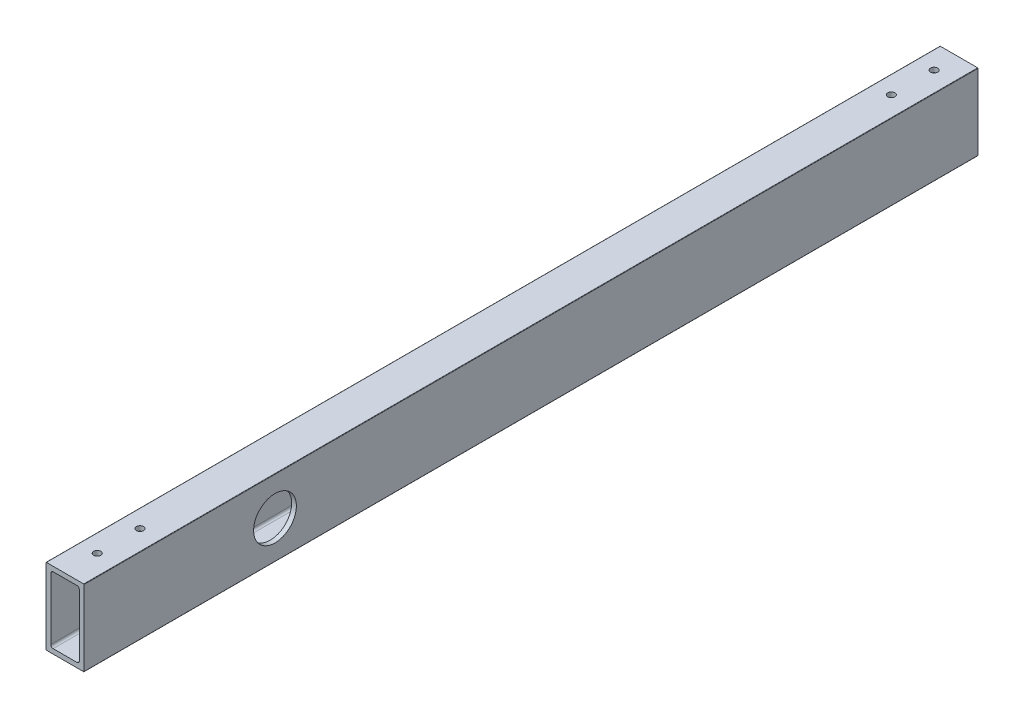
ISO-10303-21;
HEADER;
FILE_DESCRIPTION(('STEP AP214'),'2;1');
FILE_NAME('part.step','',(''),(''),'','','');
FILE_SCHEMA(('AUTOMOTIVE_DESIGN { 1 0 10303 214 1 1 1 1 }'));
ENDSEC;
DATA;
#1=APPLICATION_CONTEXT('core data for automotive mechanical design processes');
#2=APPLICATION_PROTOCOL_DEFINITION('international standard','automotive_design',2000,#1);
#3=PRODUCT_CONTEXT('',#1,'mechanical');
#4=PRODUCT('Part','Part','',(#3));
#5=PRODUCT_RELATED_PRODUCT_CATEGORY('part','',(#4));
#6=PRODUCT_DEFINITION_FORMATION('','',#4);
#7=PRODUCT_DEFINITION_CONTEXT('part definition',#1,'design');
#8=PRODUCT_DEFINITION('design','',#6,#7);
#9=PRODUCT_DEFINITION_SHAPE('','',#8);
#10=(LENGTH_UNIT() NAMED_UNIT(*) SI_UNIT(.MILLI.,.METRE.));
#11=(NAMED_UNIT(*) PLANE_ANGLE_UNIT() SI_UNIT($,.RADIAN.));
#12=(NAMED_UNIT(*) SI_UNIT($,.STERADIAN.) SOLID_ANGLE_UNIT());
#13=UNCERTAINTY_MEASURE_WITH_UNIT(LENGTH_MEASURE(1.E-05),#10,'distance_accuracy_value','');
#14=(GEOMETRIC_REPRESENTATION_CONTEXT(3) GLOBAL_UNCERTAINTY_ASSIGNED_CONTEXT((#13)) GLOBAL_UNIT_ASSIGNED_CONTEXT((#10,
#11,#12)) REPRESENTATION_CONTEXT('',''));
#15=CARTESIAN_POINT('',(0.,0.,0.));
#16=DIRECTION('',(0.,0.,1.));
#17=DIRECTION('',(1.,0.,0.));
#18=AXIS2_PLACEMENT_3D('',#15,#16,#17);
#19=CARTESIAN_POINT('',(3.175,4.7625,1828.8));
#20=DIRECTION('',(1.,0.,0.));
#21=DIRECTION('',(0.,1.,0.));
#22=AXIS2_PLACEMENT_3D('',#19,#20,#21);
#23=PLANE('',#22);
#24=CARTESIAN_POINT('',(3.175,25.146,475.742));
#25=DIRECTION('',(1.,0.,0.));
#26=DIRECTION('',(0.,0.,-1.));
#27=AXIS2_PLACEMENT_3D('',#24,#25,#26);
#28=CIRCLE('',#27,14.2875);
#29=CARTESIAN_POINT('',(3.175,25.146,490.0295));
#30=VERTEX_POINT('',#29);
#31=EDGE_CURVE('E497',#30,#30,#28,.T.);
#32=ORIENTED_EDGE('',*,*,#31,.F.);
#33=EDGE_LOOP('',(#32));
#34=FACE_BOUND('',#33,.T.);
#35=DIRECTION('',(0.,0.,-1.));
#36=VECTOR('',#35,1.);
#37=CARTESIAN_POINT('',(3.175,4.7625,1828.8));
#38=LINE('',#37,#36);
#39=CARTESIAN_POINT('',(3.175,4.7625,603.25));
#40=VERTEX_POINT('',#39);
#41=CARTESIAN_POINT('',(3.175,4.7625,6.35000000000008));
#42=VERTEX_POINT('',#41);
#43=EDGE_CURVE('E223',#40,#42,#38,.T.);
#44=ORIENTED_EDGE('',*,*,#43,.T.);
#45=DIRECTION('',(0.,1.,0.));
#46=VECTOR('',#45,1.);
#47=CARTESIAN_POINT('',(3.175,4.7625,6.35000000000008));
#48=LINE('',#47,#46);
#49=CARTESIAN_POINT('',(3.175,46.0375,6.35000000000008));
#50=VERTEX_POINT('',#49);
#51=EDGE_CURVE('E58',#42,#50,#48,.T.);
#52=ORIENTED_EDGE('',*,*,#51,.T.);
#53=DIRECTION('',(0.,0.,-1.));
#54=VECTOR('',#53,1.);
#55=CARTESIAN_POINT('',(3.175,46.0375,1828.8));
#56=LINE('',#55,#54);
#57=CARTESIAN_POINT('',(3.175,46.0375,603.25));
#58=VERTEX_POINT('',#57);
#59=EDGE_CURVE('E198',#58,#50,#56,.T.);
#60=ORIENTED_EDGE('',*,*,#59,.F.);
#61=DIRECTION('',(0.,-1.,0.));
#62=VECTOR('',#61,1.);
#63=CARTESIAN_POINT('',(3.175,4.7625,603.25));
#64=LINE('',#63,#62);
#65=EDGE_CURVE('E184',#58,#40,#64,.T.);
#66=ORIENTED_EDGE('',*,*,#65,.T.);
#67=EDGE_LOOP('',(#44,#52,#60,#66));
#68=FACE_BOUND('',#67,.T.);
#69=ADVANCED_FACE('F43',(#34,#68),#23,.T.);
#70=CARTESIAN_POINT('',(4.7625,46.0375,1828.8));
#71=DIRECTION('',(0.,0.,-1.));
#72=DIRECTION('',(-1.,0.,0.));
#73=AXIS2_PLACEMENT_3D('',#70,#71,#72);
#74=CYLINDRICAL_SURFACE('',#73,1.5875);
#75=CARTESIAN_POINT('',(4.7625,46.0375,6.35000000000008));
#76=DIRECTION('',(0.,0.,-1.));
#77=DIRECTION('',(-1.,0.,0.));
#78=AXIS2_PLACEMENT_3D('',#75,#76,#77);
#79=CIRCLE('',#78,1.5875);
#80=CARTESIAN_POINT('',(4.7625,47.625,6.35000000000008));
#81=VERTEX_POINT('',#80);
#82=EDGE_CURVE('E254',#81,#50,#79,.F.);
#83=ORIENTED_EDGE('',*,*,#82,.F.);
#84=DIRECTION('',(0.,0.,-1.));
#85=VECTOR('',#84,1.);
#86=CARTESIAN_POINT('',(4.7625,47.625,1828.8));
#87=LINE('',#86,#85);
#88=CARTESIAN_POINT('',(4.7625,47.625,603.25));
#89=VERTEX_POINT('',#88);
#90=EDGE_CURVE('E201',#89,#81,#87,.T.);
#91=ORIENTED_EDGE('',*,*,#90,.F.);
#92=CARTESIAN_POINT('',(4.7625,46.0375,603.25));
#93=DIRECTION('',(0.,0.,1.));
#94=DIRECTION('',(1.,0.,0.));
#95=AXIS2_PLACEMENT_3D('',#92,#93,#94);
#96=CIRCLE('',#95,1.5875);
#97=EDGE_CURVE('E314',#58,#89,#96,.F.);
#98=ORIENTED_EDGE('',*,*,#97,.F.);
#99=ORIENTED_EDGE('',*,*,#59,.T.);
#100=EDGE_LOOP('',(#83,#91,#98,#99));
#101=FACE_BOUND('',#100,.T.);
#102=ADVANCED_FACE('F367',(#101),#74,.F.);
#103=CARTESIAN_POINT('',(4.7625,47.625,1828.8));
#104=DIRECTION('',(0.,-1.,0.));
#105=DIRECTION('',(0.,0.,-1.));
#106=AXIS2_PLACEMENT_3D('',#103,#104,#105);
#107=PLANE('',#106);
#108=CARTESIAN_POINT('',(11.9757060888018,47.625,581.025));
#109=DIRECTION('',(0.,-1.,0.));
#110=DIRECTION('',(0.,0.,-1.));
#111=AXIS2_PLACEMENT_3D('',#108,#109,#110);
#112=CIRCLE('',#111,2.38125000000002);
#113=CARTESIAN_POINT('',(11.9757060888018,47.625,578.64375));
#114=VERTEX_POINT('',#113);
#115=EDGE_CURVE('E283',#114,#114,#112,.T.);
#116=ORIENTED_EDGE('',*,*,#115,.F.);
#117=EDGE_LOOP('',(#116));
#118=FACE_BOUND('',#117,.T.);
#119=CARTESIAN_POINT('',(11.9757060888017,47.625,50.8));
#120=DIRECTION('',(0.,-1.,0.));
#121=DIRECTION('',(0.,0.,-1.));
#122=AXIS2_PLACEMENT_3D('',#119,#120,#121);
#123=CIRCLE('',#122,2.38125);
#124=CARTESIAN_POINT('',(11.9757060888017,47.625,48.41875));
#125=VERTEX_POINT('',#124);
#126=EDGE_CURVE('E280',#125,#125,#123,.T.);
#127=ORIENTED_EDGE('',*,*,#126,.F.);
#128=EDGE_LOOP('',(#127));
#129=FACE_BOUND('',#128,.T.);
#130=CARTESIAN_POINT('',(11.9757060888017,47.625,22.2249999999999));
#131=DIRECTION('',(0.,-1.,0.));
#132=DIRECTION('',(0.,0.,-1.));
#133=AXIS2_PLACEMENT_3D('',#130,#131,#132);
#134=CIRCLE('',#133,2.38125);
#135=CARTESIAN_POINT('',(11.9757060888017,47.625,19.8437499999999));
#136=VERTEX_POINT('',#135);
#137=EDGE_CURVE('E277',#136,#136,#134,.T.);
#138=ORIENTED_EDGE('',*,*,#137,.F.);
#139=EDGE_LOOP('',(#138));
#140=FACE_BOUND('',#139,.T.);
#141=CARTESIAN_POINT('',(11.9757060888018,47.625,552.45));
#142=DIRECTION('',(0.,-1.,0.));
#143=DIRECTION('',(0.,0.,-1.));
#144=AXIS2_PLACEMENT_3D('',#141,#142,#143);
#145=CIRCLE('',#144,2.38125000000002);
#146=CARTESIAN_POINT('',(11.9757060888018,47.625,550.06875));
#147=VERTEX_POINT('',#146);
#148=EDGE_CURVE('E266',#147,#147,#145,.T.);
#149=ORIENTED_EDGE('',*,*,#148,.F.);
#150=EDGE_LOOP('',(#149));
#151=FACE_BOUND('',#150,.T.);
#152=ORIENTED_EDGE('',*,*,#90,.T.);
#153=DIRECTION('',(1.,0.,0.));
#154=VECTOR('',#153,1.);
#155=CARTESIAN_POINT('',(4.7625,47.625,6.35000000000008));
#156=LINE('',#155,#154);
#157=CARTESIAN_POINT('',(20.6375,47.625,6.35000000000008));
#158=VERTEX_POINT('',#157);
#159=EDGE_CURVE('E253',#81,#158,#156,.T.);
#160=ORIENTED_EDGE('',*,*,#159,.T.);
#161=DIRECTION('',(0.,0.,-1.));
#162=VECTOR('',#161,1.);
#163=CARTESIAN_POINT('',(20.6375,47.625,1828.8));
#164=LINE('',#163,#162);
#165=CARTESIAN_POINT('',(20.6375,47.625,603.25));
#166=VERTEX_POINT('',#165);
#167=EDGE_CURVE('E212',#166,#158,#164,.T.);
#168=ORIENTED_EDGE('',*,*,#167,.F.);
#169=DIRECTION('',(-1.,0.,0.));
#170=VECTOR('',#169,1.);
#171=CARTESIAN_POINT('',(4.7625,47.625,603.25));
#172=LINE('',#171,#170);
#173=EDGE_CURVE('E251',#166,#89,#172,.T.);
#174=ORIENTED_EDGE('',*,*,#173,.T.);
#175=EDGE_LOOP('',(#152,#160,#168,#174));
#176=FACE_BOUND('',#175,.T.);
#177=ADVANCED_FACE('F250',(#118,#129,#140,#151,#176),#107,.T.);
#178=CARTESIAN_POINT('',(20.6375,46.0375,1828.8));
#179=DIRECTION('',(0.,0.,-1.));
#180=DIRECTION('',(-1.,0.,0.));
#181=AXIS2_PLACEMENT_3D('',#178,#179,#180);
#182=CYLINDRICAL_SURFACE('',#181,1.5875);
#183=CARTESIAN_POINT('',(20.6375,46.0375,6.35000000000008));
#184=DIRECTION('',(0.,0.,-1.));
#185=DIRECTION('',(-1.,0.,0.));
#186=AXIS2_PLACEMENT_3D('',#183,#184,#185);
#187=CIRCLE('',#186,1.5875);
#188=CARTESIAN_POINT('',(22.225,46.0375,6.35000000000008));
#189=VERTEX_POINT('',#188);
#190=EDGE_CURVE('E245',#189,#158,#187,.F.);
#191=ORIENTED_EDGE('',*,*,#190,.F.);
#192=DIRECTION('',(0.,0.,-1.));
#193=VECTOR('',#192,1.);
#194=CARTESIAN_POINT('',(22.225,46.0375,1828.8));
#195=LINE('',#194,#193);
#196=CARTESIAN_POINT('',(22.225,46.0375,603.25));
#197=VERTEX_POINT('',#196);
#198=EDGE_CURVE('E227',#197,#189,#195,.T.);
#199=ORIENTED_EDGE('',*,*,#198,.F.);
#200=CARTESIAN_POINT('',(20.6375,46.0375,603.25));
#201=DIRECTION('',(0.,0.,1.));
#202=DIRECTION('',(1.,0.,0.));
#203=AXIS2_PLACEMENT_3D('',#200,#201,#202);
#204=CIRCLE('',#203,1.5875);
#205=EDGE_CURVE('E246',#166,#197,#204,.F.);
#206=ORIENTED_EDGE('',*,*,#205,.F.);
#207=ORIENTED_EDGE('',*,*,#167,.T.);
#208=EDGE_LOOP('',(#191,#199,#206,#207));
#209=FACE_BOUND('',#208,.T.);
#210=ADVANCED_FACE('F244',(#209),#182,.F.);
#211=CARTESIAN_POINT('',(22.225,4.7625,1828.8));
#212=DIRECTION('',(-1.,0.,0.));
#213=DIRECTION('',(0.,0.,1.));
#214=AXIS2_PLACEMENT_3D('',#211,#212,#213);
#215=PLANE('',#214);
#216=CARTESIAN_POINT('',(22.225,25.146,475.742));
#217=DIRECTION('',(-1.,0.,0.));
#218=DIRECTION('',(0.,0.,1.));
#219=AXIS2_PLACEMENT_3D('',#216,#217,#218);
#220=CIRCLE('',#219,14.2875);
#221=CARTESIAN_POINT('',(22.225,25.146,490.0295));
#222=VERTEX_POINT('',#221);
#223=EDGE_CURVE('E504',#222,#222,#220,.T.);
#224=ORIENTED_EDGE('',*,*,#223,.F.);
#225=EDGE_LOOP('',(#224));
#226=FACE_BOUND('',#225,.T.);
#227=ORIENTED_EDGE('',*,*,#198,.T.);
#228=DIRECTION('',(0.,-1.,0.));
#229=VECTOR('',#228,1.);
#230=CARTESIAN_POINT('',(22.225,4.7625,6.35000000000008));
#231=LINE('',#230,#229);
#232=CARTESIAN_POINT('',(22.225,4.7625,6.35000000000008));
#233=VERTEX_POINT('',#232);
#234=EDGE_CURVE('E257',#189,#233,#231,.T.);
#235=ORIENTED_EDGE('',*,*,#234,.T.);
#236=DIRECTION('',(0.,0.,-1.));
#237=VECTOR('',#236,1.);
#238=CARTESIAN_POINT('',(22.225,4.7625,1828.8));
#239=LINE('',#238,#237);
#240=CARTESIAN_POINT('',(22.225,4.7625,603.25));
#241=VERTEX_POINT('',#240);
#242=EDGE_CURVE('E224',#241,#233,#239,.T.);
#243=ORIENTED_EDGE('',*,*,#242,.F.);
#244=DIRECTION('',(0.,1.,0.));
#245=VECTOR('',#244,1.);
#246=CARTESIAN_POINT('',(22.225,4.7625,603.25));
#247=LINE('',#246,#245);
#248=EDGE_CURVE('E310',#241,#197,#247,.T.);
#249=ORIENTED_EDGE('',*,*,#248,.T.);
#250=EDGE_LOOP('',(#227,#235,#243,#249));
#251=FACE_BOUND('',#250,.T.);
#252=ADVANCED_FACE('F341',(#226,#251),#215,.T.);
#253=CARTESIAN_POINT('',(20.6375,4.7625,1828.8));
#254=DIRECTION('',(0.,0.,-1.));
#255=DIRECTION('',(-1.,0.,0.));
#256=AXIS2_PLACEMENT_3D('',#253,#254,#255);
#257=CYLINDRICAL_SURFACE('',#256,1.5875);
#258=CARTESIAN_POINT('',(20.6375,4.7625,6.35000000000008));
#259=DIRECTION('',(0.,0.,-1.));
#260=DIRECTION('',(-1.,0.,0.));
#261=AXIS2_PLACEMENT_3D('',#258,#259,#260);
#262=CIRCLE('',#261,1.5875);
#263=CARTESIAN_POINT('',(20.6375,3.175,6.35000000000008));
#264=VERTEX_POINT('',#263);
#265=EDGE_CURVE('E336',#264,#233,#262,.F.);
#266=ORIENTED_EDGE('',*,*,#265,.F.);
#267=DIRECTION('',(0.,0.,-1.));
#268=VECTOR('',#267,1.);
#269=CARTESIAN_POINT('',(20.6375,3.175,1828.8));
#270=LINE('',#269,#268);
#271=CARTESIAN_POINT('',(20.6375,3.175,603.25));
#272=VERTEX_POINT('',#271);
#273=EDGE_CURVE('E188',#272,#264,#270,.T.);
#274=ORIENTED_EDGE('',*,*,#273,.F.);
#275=CARTESIAN_POINT('',(20.6375,4.7625,603.25));
#276=DIRECTION('',(0.,0.,1.));
#277=DIRECTION('',(1.,0.,0.));
#278=AXIS2_PLACEMENT_3D('',#275,#276,#277);
#279=CIRCLE('',#278,1.5875);
#280=EDGE_CURVE('E308',#241,#272,#279,.F.);
#281=ORIENTED_EDGE('',*,*,#280,.F.);
#282=ORIENTED_EDGE('',*,*,#242,.T.);
#283=EDGE_LOOP('',(#266,#274,#281,#282));
#284=FACE_BOUND('',#283,.T.);
#285=ADVANCED_FACE('F45',(#284),#257,.F.);
#286=CARTESIAN_POINT('',(4.7625,3.175,1828.8));
#287=DIRECTION('',(0.,1.,0.));
#288=DIRECTION('',(1.,0.,0.));
#289=AXIS2_PLACEMENT_3D('',#286,#287,#288);
#290=PLANE('',#289);
#291=ORIENTED_EDGE('',*,*,#273,.T.);
#292=DIRECTION('',(-1.,0.,0.));
#293=VECTOR('',#292,1.);
#294=CARTESIAN_POINT('',(4.7625,3.175,6.35000000000008));
#295=LINE('',#294,#293);
#296=CARTESIAN_POINT('',(4.7625,3.175,6.35000000000008));
#297=VERTEX_POINT('',#296);
#298=EDGE_CURVE('E334',#264,#297,#295,.T.);
#299=ORIENTED_EDGE('',*,*,#298,.T.);
#300=DIRECTION('',(0.,0.,-1.));
#301=VECTOR('',#300,1.);
#302=CARTESIAN_POINT('',(4.7625,3.175,1828.8));
#303=LINE('',#302,#301);
#304=CARTESIAN_POINT('',(4.7625,3.175,603.25));
#305=VERTEX_POINT('',#304);
#306=EDGE_CURVE('E219',#305,#297,#303,.T.);
#307=ORIENTED_EDGE('',*,*,#306,.F.);
#308=DIRECTION('',(1.,0.,0.));
#309=VECTOR('',#308,1.);
#310=CARTESIAN_POINT('',(4.7625,3.175,603.25));
#311=LINE('',#310,#309);
#312=EDGE_CURVE('E305',#305,#272,#311,.T.);
#313=ORIENTED_EDGE('',*,*,#312,.T.);
#314=EDGE_LOOP('',(#291,#299,#307,#313));
#315=FACE_BOUND('',#314,.T.);
#316=ADVANCED_FACE('F351',(#315),#290,.T.);
#317=CARTESIAN_POINT('',(4.7625,4.7625,1828.8));
#318=DIRECTION('',(0.,0.,-1.));
#319=DIRECTION('',(-1.,0.,0.));
#320=AXIS2_PLACEMENT_3D('',#317,#318,#319);
#321=CYLINDRICAL_SURFACE('',#320,1.5875);
#322=CARTESIAN_POINT('',(4.7625,4.7625,6.35000000000008));
#323=DIRECTION('',(0.,0.,-1.));
#324=DIRECTION('',(-1.,0.,0.));
#325=AXIS2_PLACEMENT_3D('',#322,#323,#324);
#326=CIRCLE('',#325,1.5875);
#327=EDGE_CURVE('E168',#42,#297,#326,.F.);
#328=ORIENTED_EDGE('',*,*,#327,.F.);
#329=ORIENTED_EDGE('',*,*,#43,.F.);
#330=CARTESIAN_POINT('',(4.7625,4.7625,603.25));
#331=DIRECTION('',(0.,0.,1.));
#332=DIRECTION('',(1.,0.,0.));
#333=AXIS2_PLACEMENT_3D('',#330,#331,#332);
#334=CIRCLE('',#333,1.5875);
#335=EDGE_CURVE('E303',#305,#40,#334,.F.);
#336=ORIENTED_EDGE('',*,*,#335,.F.);
#337=ORIENTED_EDGE('',*,*,#306,.T.);
#338=EDGE_LOOP('',(#328,#329,#336,#337));
#339=FACE_BOUND('',#338,.T.);
#340=ADVANCED_FACE('F331',(#339),#321,.F.);
#341=CARTESIAN_POINT('',(0.,0.254,1828.8));
#342=DIRECTION('',(1.,0.,0.));
#343=DIRECTION('',(0.,1.,0.));
#344=AXIS2_PLACEMENT_3D('',#341,#342,#343);
#345=PLANE('',#344);
#346=CARTESIAN_POINT('',(0.,25.146,475.742));
#347=DIRECTION('',(-1.,0.,0.));
#348=DIRECTION('',(0.,0.,1.));
#349=AXIS2_PLACEMENT_3D('',#346,#347,#348);
#350=CIRCLE('',#349,14.2875);
#351=CARTESIAN_POINT('',(0.,25.146,490.0295));
#352=VERTEX_POINT('',#351);
#353=EDGE_CURVE('E500',#352,#352,#350,.T.);
#354=ORIENTED_EDGE('',*,*,#353,.F.);
#355=EDGE_LOOP('',(#354));
#356=FACE_BOUND('',#355,.T.);
#357=DIRECTION('',(0.,1.,0.));
#358=VECTOR('',#357,1.);
#359=CARTESIAN_POINT('',(0.,0.254,6.35000000000008));
#360=LINE('',#359,#358);
#361=CARTESIAN_POINT('',(0.,0.254,6.35000000000008));
#362=VERTEX_POINT('',#361);
#363=CARTESIAN_POINT('',(0.,50.546,6.35000000000008));
#364=VERTEX_POINT('',#363);
#365=EDGE_CURVE('E154',#362,#364,#360,.T.);
#366=ORIENTED_EDGE('',*,*,#365,.F.);
#367=DIRECTION('',(0.,0.,-1.));
#368=VECTOR('',#367,1.);
#369=CARTESIAN_POINT('',(0.,0.254,1828.8));
#370=LINE('',#369,#368);
#371=CARTESIAN_POINT('',(0.,0.254,603.25));
#372=VERTEX_POINT('',#371);
#373=EDGE_CURVE('E165',#372,#362,#370,.T.);
#374=ORIENTED_EDGE('',*,*,#373,.F.);
#375=DIRECTION('',(0.,-1.,0.));
#376=VECTOR('',#375,1.);
#377=CARTESIAN_POINT('',(0.,0.254,603.25));
#378=LINE('',#377,#376);
#379=CARTESIAN_POINT('',(0.,50.546,603.25));
#380=VERTEX_POINT('',#379);
#381=EDGE_CURVE('E301',#380,#372,#378,.T.);
#382=ORIENTED_EDGE('',*,*,#381,.F.);
#383=DIRECTION('',(0.,0.,-1.));
#384=VECTOR('',#383,1.);
#385=CARTESIAN_POINT('',(0.,50.546,1828.8));
#386=LINE('',#385,#384);
#387=EDGE_CURVE('E167',#380,#364,#386,.T.);
#388=ORIENTED_EDGE('',*,*,#387,.T.);
#389=EDGE_LOOP('',(#366,#374,#382,#388));
#390=FACE_BOUND('',#389,.T.);
#391=ADVANCED_FACE('F163',(#356,#390),#345,.F.);
#392=CARTESIAN_POINT('',(0.254,50.546,1828.8));
#393=DIRECTION('',(0.,0.,-1.));
#394=DIRECTION('',(-1.,0.,0.));
#395=AXIS2_PLACEMENT_3D('',#392,#393,#394);
#396=CYLINDRICAL_SURFACE('',#395,0.253999999999995);
#397=DIRECTION('',(0.,0.,-1.));
#398=VECTOR('',#397,1.);
#399=CARTESIAN_POINT('',(0.254,50.8,1828.8));
#400=LINE('',#399,#398);
#401=CARTESIAN_POINT('',(0.254,50.8,603.25));
#402=VERTEX_POINT('',#401);
#403=CARTESIAN_POINT('',(0.254,50.8,6.35000000000008));
#404=VERTEX_POINT('',#403);
#405=EDGE_CURVE('E190',#402,#404,#400,.T.);
#406=ORIENTED_EDGE('',*,*,#405,.T.);
#407=CARTESIAN_POINT('',(0.254,50.546,6.35000000000008));
#408=DIRECTION('',(0.,0.,-1.));
#409=DIRECTION('',(-1.,0.,0.));
#410=AXIS2_PLACEMENT_3D('',#407,#408,#409);
#411=CIRCLE('',#410,0.253999999999995);
#412=EDGE_CURVE('E169',#404,#364,#411,.F.);
#413=ORIENTED_EDGE('',*,*,#412,.T.);
#414=ORIENTED_EDGE('',*,*,#387,.F.);
#415=CARTESIAN_POINT('',(0.254,50.546,603.25));
#416=DIRECTION('',(0.,0.,1.));
#417=DIRECTION('',(1.,0.,0.));
#418=AXIS2_PLACEMENT_3D('',#415,#416,#417);
#419=CIRCLE('',#418,0.253999999999995);
#420=EDGE_CURVE('E298',#380,#402,#419,.F.);
#421=ORIENTED_EDGE('',*,*,#420,.T.);
#422=EDGE_LOOP('',(#406,#413,#414,#421));
#423=FACE_BOUND('',#422,.T.);
#424=ADVANCED_FACE('F378',(#423),#396,.T.);
#425=CARTESIAN_POINT('',(0.254,50.8,1828.8));
#426=DIRECTION('',(0.,-1.,0.));
#427=DIRECTION('',(0.,0.,-1.));
#428=AXIS2_PLACEMENT_3D('',#425,#426,#427);
#429=PLANE('',#428);
#430=CARTESIAN_POINT('',(11.9757060888018,50.8,552.45));
#431=DIRECTION('',(0.,1.,0.));
#432=DIRECTION('',(0.,0.,1.));
#433=AXIS2_PLACEMENT_3D('',#430,#431,#432);
#434=CIRCLE('',#433,2.38125000000002);
#435=CARTESIAN_POINT('',(11.9757060888018,50.8,554.83125));
#436=VERTEX_POINT('',#435);
#437=EDGE_CURVE('E267',#436,#436,#434,.T.);
#438=ORIENTED_EDGE('',*,*,#437,.F.);
#439=EDGE_LOOP('',(#438));
#440=FACE_BOUND('',#439,.T.);
#441=CARTESIAN_POINT('',(11.9757060888017,50.8,22.2249999999999));
#442=DIRECTION('',(0.,1.,0.));
#443=DIRECTION('',(0.,0.,-1.));
#444=AXIS2_PLACEMENT_3D('',#441,#442,#443);
#445=CIRCLE('',#444,2.38125);
#446=CARTESIAN_POINT('',(11.9757060888017,50.8,19.8437499999999));
#447=VERTEX_POINT('',#446);
#448=EDGE_CURVE('E270',#447,#447,#445,.T.);
#449=ORIENTED_EDGE('',*,*,#448,.F.);
#450=EDGE_LOOP('',(#449));
#451=FACE_BOUND('',#450,.T.);
#452=CARTESIAN_POINT('',(11.9757060888017,50.8,50.8));
#453=DIRECTION('',(0.,1.,0.));
#454=DIRECTION('',(0.,0.,-1.));
#455=AXIS2_PLACEMENT_3D('',#452,#453,#454);
#456=CIRCLE('',#455,2.38125);
#457=CARTESIAN_POINT('',(11.9757060888017,50.8,48.41875));
#458=VERTEX_POINT('',#457);
#459=EDGE_CURVE('E262',#458,#458,#456,.T.);
#460=ORIENTED_EDGE('',*,*,#459,.F.);
#461=EDGE_LOOP('',(#460));
#462=FACE_BOUND('',#461,.T.);
#463=CARTESIAN_POINT('',(11.9757060888018,50.8,581.025));
#464=DIRECTION('',(0.,1.,0.));
#465=DIRECTION('',(0.,0.,1.));
#466=AXIS2_PLACEMENT_3D('',#463,#464,#465);
#467=CIRCLE('',#466,2.38125000000002);
#468=CARTESIAN_POINT('',(11.9757060888018,50.8,583.40625));
#469=VERTEX_POINT('',#468);
#470=EDGE_CURVE('E263',#469,#469,#467,.T.);
#471=ORIENTED_EDGE('',*,*,#470,.F.);
#472=EDGE_LOOP('',(#471));
#473=FACE_BOUND('',#472,.T.);
#474=DIRECTION('',(1.,0.,0.));
#475=VECTOR('',#474,1.);
#476=CARTESIAN_POINT('',(0.254,50.8,6.35000000000008));
#477=LINE('',#476,#475);
#478=CARTESIAN_POINT('',(25.146,50.8,6.35000000000008));
#479=VERTEX_POINT('',#478);
#480=EDGE_CURVE('E519',#404,#479,#477,.T.);
#481=ORIENTED_EDGE('',*,*,#480,.F.);
#482=ORIENTED_EDGE('',*,*,#405,.F.);
#483=DIRECTION('',(-1.,0.,0.));
#484=VECTOR('',#483,1.);
#485=CARTESIAN_POINT('',(0.254,50.8,603.25));
#486=LINE('',#485,#484);
#487=CARTESIAN_POINT('',(25.146,50.8,603.25));
#488=VERTEX_POINT('',#487);
#489=EDGE_CURVE('E296',#488,#402,#486,.T.);
#490=ORIENTED_EDGE('',*,*,#489,.F.);
#491=DIRECTION('',(0.,0.,-1.));
#492=VECTOR('',#491,1.);
#493=CARTESIAN_POINT('',(25.146,50.8,1828.8));
#494=LINE('',#493,#492);
#495=EDGE_CURVE('E194',#488,#479,#494,.T.);
#496=ORIENTED_EDGE('',*,*,#495,.T.);
#497=EDGE_LOOP('',(#481,#482,#490,#496));
#498=FACE_BOUND('',#497,.T.);
#499=ADVANCED_FACE('F395',(#440,#451,#462,#473,#498),#429,.F.);
#500=CARTESIAN_POINT('',(25.146,50.546,1828.8));
#501=DIRECTION('',(0.,0.,-1.));
#502=DIRECTION('',(-1.,0.,0.));
#503=AXIS2_PLACEMENT_3D('',#500,#501,#502);
#504=CYLINDRICAL_SURFACE('',#503,0.253999999999994);
#505=DIRECTION('',(0.,0.,-1.));
#506=VECTOR('',#505,1.);
#507=CARTESIAN_POINT('',(25.4,50.546,1828.8));
#508=LINE('',#507,#506);
#509=CARTESIAN_POINT('',(25.4,50.546,603.25));
#510=VERTEX_POINT('',#509);
#511=CARTESIAN_POINT('',(25.4,50.546,6.35000000000008));
#512=VERTEX_POINT('',#511);
#513=EDGE_CURVE('E197',#510,#512,#508,.T.);
#514=ORIENTED_EDGE('',*,*,#513,.T.);
#515=CARTESIAN_POINT('',(25.146,50.546,6.35000000000008));
#516=DIRECTION('',(0.,0.,-1.));
#517=DIRECTION('',(-1.,0.,0.));
#518=AXIS2_PLACEMENT_3D('',#515,#516,#517);
#519=CIRCLE('',#518,0.253999999999994);
#520=EDGE_CURVE('E516',#512,#479,#519,.F.);
#521=ORIENTED_EDGE('',*,*,#520,.T.);
#522=ORIENTED_EDGE('',*,*,#495,.F.);
#523=CARTESIAN_POINT('',(25.146,50.546,603.25));
#524=DIRECTION('',(0.,0.,1.));
#525=DIRECTION('',(1.,0.,0.));
#526=AXIS2_PLACEMENT_3D('',#523,#524,#525);
#527=CIRCLE('',#526,0.253999999999994);
#528=EDGE_CURVE('E293',#488,#510,#527,.F.);
#529=ORIENTED_EDGE('',*,*,#528,.T.);
#530=EDGE_LOOP('',(#514,#521,#522,#529));
#531=FACE_BOUND('',#530,.T.);
#532=ADVANCED_FACE('F390',(#531),#504,.T.);
#533=CARTESIAN_POINT('',(25.4,0.254,1828.8));
#534=DIRECTION('',(-1.,0.,0.));
#535=DIRECTION('',(0.,0.,1.));
#536=AXIS2_PLACEMENT_3D('',#533,#534,#535);
#537=PLANE('',#536);
#538=CARTESIAN_POINT('',(25.4,25.146,475.742));
#539=DIRECTION('',(-1.,0.,0.));
#540=DIRECTION('',(0.,0.,1.));
#541=AXIS2_PLACEMENT_3D('',#538,#539,#540);
#542=CIRCLE('',#541,14.2875);
#543=CARTESIAN_POINT('',(25.4,25.146,490.0295));
#544=VERTEX_POINT('',#543);
#545=EDGE_CURVE('E501',#544,#544,#542,.T.);
#546=ORIENTED_EDGE('',*,*,#545,.T.);
#547=EDGE_LOOP('',(#546));
#548=FACE_BOUND('',#547,.T.);
#549=DIRECTION('',(0.,-1.,0.));
#550=VECTOR('',#549,1.);
#551=CARTESIAN_POINT('',(25.4,0.254,6.35000000000008));
#552=LINE('',#551,#550);
#553=CARTESIAN_POINT('',(25.4,0.254,6.35000000000008));
#554=VERTEX_POINT('',#553);
#555=EDGE_CURVE('E514',#512,#554,#552,.T.);
#556=ORIENTED_EDGE('',*,*,#555,.F.);
#557=ORIENTED_EDGE('',*,*,#513,.F.);
#558=DIRECTION('',(0.,1.,0.));
#559=VECTOR('',#558,1.);
#560=CARTESIAN_POINT('',(25.4,0.254,603.25));
#561=LINE('',#560,#559);
#562=CARTESIAN_POINT('',(25.4,0.254,603.25));
#563=VERTEX_POINT('',#562);
#564=EDGE_CURVE('E291',#563,#510,#561,.T.);
#565=ORIENTED_EDGE('',*,*,#564,.F.);
#566=DIRECTION('',(0.,0.,-1.));
#567=VECTOR('',#566,1.);
#568=CARTESIAN_POINT('',(25.4,0.254,1828.8));
#569=LINE('',#568,#567);
#570=EDGE_CURVE('E182',#563,#554,#569,.T.);
#571=ORIENTED_EDGE('',*,*,#570,.T.);
#572=EDGE_LOOP('',(#556,#557,#565,#571));
#573=FACE_BOUND('',#572,.T.);
#574=ADVANCED_FACE('F384',(#548,#573),#537,.F.);
#575=CARTESIAN_POINT('',(25.146,0.254,1828.8));
#576=DIRECTION('',(0.,0.,-1.));
#577=DIRECTION('',(-1.,0.,0.));
#578=AXIS2_PLACEMENT_3D('',#575,#576,#577);
#579=CYLINDRICAL_SURFACE('',#578,0.254);
#580=DIRECTION('',(0.,0.,-1.));
#581=VECTOR('',#580,1.);
#582=CARTESIAN_POINT('',(25.146,0.,1828.8));
#583=LINE('',#582,#581);
#584=CARTESIAN_POINT('',(25.146,0.,603.25));
#585=VERTEX_POINT('',#584);
#586=CARTESIAN_POINT('',(25.146,0.,6.35000000000008));
#587=VERTEX_POINT('',#586);
#588=EDGE_CURVE('E174',#585,#587,#583,.T.);
#589=ORIENTED_EDGE('',*,*,#588,.T.);
#590=CARTESIAN_POINT('',(25.146,0.254,6.35000000000008));
#591=DIRECTION('',(0.,0.,-1.));
#592=DIRECTION('',(-1.,0.,0.));
#593=AXIS2_PLACEMENT_3D('',#590,#591,#592);
#594=CIRCLE('',#593,0.254);
#595=EDGE_CURVE('E511',#587,#554,#594,.F.);
#596=ORIENTED_EDGE('',*,*,#595,.T.);
#597=ORIENTED_EDGE('',*,*,#570,.F.);
#598=CARTESIAN_POINT('',(25.146,0.254,603.25));
#599=DIRECTION('',(0.,0.,1.));
#600=DIRECTION('',(1.,0.,0.));
#601=AXIS2_PLACEMENT_3D('',#598,#599,#600);
#602=CIRCLE('',#601,0.254);
#603=EDGE_CURVE('E288',#563,#585,#602,.F.);
#604=ORIENTED_EDGE('',*,*,#603,.T.);
#605=EDGE_LOOP('',(#589,#596,#597,#604));
#606=FACE_BOUND('',#605,.T.);
#607=ADVANCED_FACE('F380',(#606),#579,.T.);
#608=CARTESIAN_POINT('',(0.254,0.,1828.8));
#609=DIRECTION('',(0.,1.,0.));
#610=DIRECTION('',(1.,0.,0.));
#611=AXIS2_PLACEMENT_3D('',#608,#609,#610);
#612=PLANE('',#611);
#613=DIRECTION('',(-1.,0.,0.));
#614=VECTOR('',#613,1.);
#615=CARTESIAN_POINT('',(0.254,0.,6.35000000000008));
#616=LINE('',#615,#614);
#617=CARTESIAN_POINT('',(0.254,0.,6.35000000000008));
#618=VERTEX_POINT('',#617);
#619=EDGE_CURVE('E66',#587,#618,#616,.T.);
#620=ORIENTED_EDGE('',*,*,#619,.F.);
#621=ORIENTED_EDGE('',*,*,#588,.F.);
#622=DIRECTION('',(1.,0.,0.));
#623=VECTOR('',#622,1.);
#624=CARTESIAN_POINT('',(0.254,0.,603.25));
#625=LINE('',#624,#623);
#626=CARTESIAN_POINT('',(0.254,0.,603.25));
#627=VERTEX_POINT('',#626);
#628=EDGE_CURVE('E286',#627,#585,#625,.T.);
#629=ORIENTED_EDGE('',*,*,#628,.F.);
#630=DIRECTION('',(0.,0.,-1.));
#631=VECTOR('',#630,1.);
#632=CARTESIAN_POINT('',(0.254,0.,1828.8));
#633=LINE('',#632,#631);
#634=EDGE_CURVE('E175',#627,#618,#633,.T.);
#635=ORIENTED_EDGE('',*,*,#634,.T.);
#636=EDGE_LOOP('',(#620,#621,#629,#635));
#637=FACE_BOUND('',#636,.T.);
#638=ADVANCED_FACE('F383',(#637),#612,.F.);
#639=CARTESIAN_POINT('',(0.254,0.254,1828.8));
#640=DIRECTION('',(0.,0.,-1.));
#641=DIRECTION('',(-1.,0.,0.));
#642=AXIS2_PLACEMENT_3D('',#639,#640,#641);
#643=CYLINDRICAL_SURFACE('',#642,0.254);
#644=ORIENTED_EDGE('',*,*,#373,.T.);
#645=CARTESIAN_POINT('',(0.254,0.254,6.35000000000008));
#646=DIRECTION('',(0.,0.,-1.));
#647=DIRECTION('',(-1.,0.,0.));
#648=AXIS2_PLACEMENT_3D('',#645,#646,#647);
#649=CIRCLE('',#648,0.254);
#650=EDGE_CURVE('E11',#362,#618,#649,.F.);
#651=ORIENTED_EDGE('',*,*,#650,.T.);
#652=ORIENTED_EDGE('',*,*,#634,.F.);
#653=CARTESIAN_POINT('',(0.254,0.254,603.25));
#654=DIRECTION('',(0.,0.,1.));
#655=DIRECTION('',(1.,0.,0.));
#656=AXIS2_PLACEMENT_3D('',#653,#654,#655);
#657=CIRCLE('',#656,0.254);
#658=EDGE_CURVE('E51',#627,#372,#657,.F.);
#659=ORIENTED_EDGE('',*,*,#658,.T.);
#660=EDGE_LOOP('',(#644,#651,#652,#659));
#661=FACE_BOUND('',#660,.T.);
#662=ADVANCED_FACE('F172',(#661),#643,.T.);
#663=CARTESIAN_POINT('',(0.,0.,603.25));
#664=DIRECTION('',(0.,0.,1.));
#665=DIRECTION('',(1.,0.,0.));
#666=AXIS2_PLACEMENT_3D('',#663,#664,#665);
#667=PLANE('',#666);
#668=ORIENTED_EDGE('',*,*,#97,.T.);
#669=ORIENTED_EDGE('',*,*,#173,.F.);
#670=ORIENTED_EDGE('',*,*,#205,.T.);
#671=ORIENTED_EDGE('',*,*,#248,.F.);
#672=ORIENTED_EDGE('',*,*,#280,.T.);
#673=ORIENTED_EDGE('',*,*,#312,.F.);
#674=ORIENTED_EDGE('',*,*,#335,.T.);
#675=ORIENTED_EDGE('',*,*,#65,.F.);
#676=EDGE_LOOP('',(#668,#669,#670,#671,#672,#673,#674,#675));
#677=FACE_BOUND('',#676,.T.);
#678=ORIENTED_EDGE('',*,*,#381,.T.);
#679=ORIENTED_EDGE('',*,*,#658,.F.);
#680=ORIENTED_EDGE('',*,*,#628,.T.);
#681=ORIENTED_EDGE('',*,*,#603,.F.);
#682=ORIENTED_EDGE('',*,*,#564,.T.);
#683=ORIENTED_EDGE('',*,*,#528,.F.);
#684=ORIENTED_EDGE('',*,*,#489,.T.);
#685=ORIENTED_EDGE('',*,*,#420,.F.);
#686=EDGE_LOOP('',(#678,#679,#680,#681,#682,#683,#684,#685));
#687=FACE_BOUND('',#686,.T.);
#688=ADVANCED_FACE('F348',(#677,#687),#667,.T.);
#689=CARTESIAN_POINT('',(11.9757060888018,23.368,552.45));
#690=DIRECTION('',(0.,1.,0.));
#691=DIRECTION('',(0.,0.,1.));
#692=AXIS2_PLACEMENT_3D('',#689,#690,#691);
#693=CYLINDRICAL_SURFACE('',#692,2.38125000000002);
#694=ORIENTED_EDGE('',*,*,#148,.T.);
#695=EDGE_LOOP('',(#694));
#696=FACE_BOUND('',#695,.T.);
#697=ORIENTED_EDGE('',*,*,#437,.T.);
#698=EDGE_LOOP('',(#697));
#699=FACE_BOUND('',#698,.T.);
#700=ADVANCED_FACE('F411',(#696,#699),#693,.F.);
#701=CARTESIAN_POINT('',(11.9757060888017,23.368,22.2249999999999));
#702=DIRECTION('',(0.,1.,0.));
#703=DIRECTION('',(0.,0.,1.));
#704=AXIS2_PLACEMENT_3D('',#701,#702,#703);
#705=CYLINDRICAL_SURFACE('',#704,2.38125);
#706=ORIENTED_EDGE('',*,*,#137,.T.);
#707=EDGE_LOOP('',(#706));
#708=FACE_BOUND('',#707,.T.);
#709=ORIENTED_EDGE('',*,*,#448,.T.);
#710=EDGE_LOOP('',(#709));
#711=FACE_BOUND('',#710,.T.);
#712=ADVANCED_FACE('F669',(#708,#711),#705,.F.);
#713=CARTESIAN_POINT('',(11.9757060888017,23.368,50.8));
#714=DIRECTION('',(0.,1.,0.));
#715=DIRECTION('',(0.,0.,1.));
#716=AXIS2_PLACEMENT_3D('',#713,#714,#715);
#717=CYLINDRICAL_SURFACE('',#716,2.38125);
#718=ORIENTED_EDGE('',*,*,#126,.T.);
#719=EDGE_LOOP('',(#718));
#720=FACE_BOUND('',#719,.T.);
#721=ORIENTED_EDGE('',*,*,#459,.T.);
#722=EDGE_LOOP('',(#721));
#723=FACE_BOUND('',#722,.T.);
#724=ADVANCED_FACE('F363',(#720,#723),#717,.F.);
#725=CARTESIAN_POINT('',(11.9757060888018,23.368,581.025));
#726=DIRECTION('',(0.,1.,0.));
#727=DIRECTION('',(0.,0.,1.));
#728=AXIS2_PLACEMENT_3D('',#725,#726,#727);
#729=CYLINDRICAL_SURFACE('',#728,2.38125000000002);
#730=ORIENTED_EDGE('',*,*,#115,.T.);
#731=EDGE_LOOP('',(#730));
#732=FACE_BOUND('',#731,.T.);
#733=ORIENTED_EDGE('',*,*,#470,.T.);
#734=EDGE_LOOP('',(#733));
#735=FACE_BOUND('',#734,.T.);
#736=ADVANCED_FACE('F354',(#732,#735),#729,.F.);
#737=CARTESIAN_POINT('',(0.,0.,6.35));
#738=DIRECTION('',(0.,0.,-1.));
#739=DIRECTION('',(-1.,0.,0.));
#740=AXIS2_PLACEMENT_3D('',#737,#738,#739);
#741=PLANE('',#740);
#742=ORIENTED_EDGE('',*,*,#327,.T.);
#743=ORIENTED_EDGE('',*,*,#298,.F.);
#744=ORIENTED_EDGE('',*,*,#265,.T.);
#745=ORIENTED_EDGE('',*,*,#234,.F.);
#746=ORIENTED_EDGE('',*,*,#190,.T.);
#747=ORIENTED_EDGE('',*,*,#159,.F.);
#748=ORIENTED_EDGE('',*,*,#82,.T.);
#749=ORIENTED_EDGE('',*,*,#51,.F.);
#750=EDGE_LOOP('',(#742,#743,#744,#745,#746,#747,#748,#749));
#751=FACE_BOUND('',#750,.T.);
#752=ORIENTED_EDGE('',*,*,#365,.T.);
#753=ORIENTED_EDGE('',*,*,#412,.F.);
#754=ORIENTED_EDGE('',*,*,#480,.T.);
#755=ORIENTED_EDGE('',*,*,#520,.F.);
#756=ORIENTED_EDGE('',*,*,#555,.T.);
#757=ORIENTED_EDGE('',*,*,#595,.F.);
#758=ORIENTED_EDGE('',*,*,#619,.T.);
#759=ORIENTED_EDGE('',*,*,#650,.F.);
#760=EDGE_LOOP('',(#752,#753,#754,#755,#756,#757,#758,#759));
#761=FACE_BOUND('',#760,.T.);
#762=ADVANCED_FACE('F153',(#751,#761),#741,.T.);
#763=CARTESIAN_POINT('',(25.4,25.146,475.742));
#764=DIRECTION('',(-1.,0.,0.));
#765=DIRECTION('',(0.,0.,1.));
#766=AXIS2_PLACEMENT_3D('',#763,#764,#765);
#767=CYLINDRICAL_SURFACE('',#766,14.2875);
#768=CARTESIAN_POINT('',(22.225,25.146,490.0295));
#769=CARTESIAN_POINT('',(22.2580729166667,25.146,490.0295));
#770=CARTESIAN_POINT('',(22.2911458333333,25.146,490.0295));
#771=CARTESIAN_POINT('',(22.3572916666667,25.146,490.0295));
#772=CARTESIAN_POINT('',(22.3903645833333,25.146,490.0295));
#773=CARTESIAN_POINT('',(22.4565104166667,25.146,490.0295));
#774=CARTESIAN_POINT('',(22.4895833333333,25.146,490.0295));
#775=CARTESIAN_POINT('',(22.5557291666667,25.146,490.0295));
#776=CARTESIAN_POINT('',(22.5888020833333,25.146,490.0295));
#777=CARTESIAN_POINT('',(22.6549479166667,25.146,490.0295));
#778=CARTESIAN_POINT('',(22.6880208333333,25.146,490.0295));
#779=CARTESIAN_POINT('',(22.7541666666667,25.146,490.0295));
#780=CARTESIAN_POINT('',(22.7872395833333,25.146,490.0295));
#781=CARTESIAN_POINT('',(22.8533854166667,25.146,490.0295));
#782=CARTESIAN_POINT('',(22.8864583333333,25.146,490.0295));
#783=CARTESIAN_POINT('',(22.9526041666667,25.146,490.0295));
#784=CARTESIAN_POINT('',(22.9856770833333,25.146,490.0295));
#785=CARTESIAN_POINT('',(23.0518229166667,25.146,490.0295));
#786=CARTESIAN_POINT('',(23.0848958333333,25.146,490.0295));
#787=CARTESIAN_POINT('',(23.1510416666667,25.146,490.0295));
#788=CARTESIAN_POINT('',(23.1841145833333,25.146,490.0295));
#789=CARTESIAN_POINT('',(23.2502604166667,25.146,490.0295));
#790=CARTESIAN_POINT('',(23.2833333333333,25.146,490.0295));
#791=CARTESIAN_POINT('',(23.3494791666667,25.146,490.0295));
#792=CARTESIAN_POINT('',(23.3825520833333,25.146,490.0295));
#793=CARTESIAN_POINT('',(23.4486979166667,25.146,490.0295));
#794=CARTESIAN_POINT('',(23.4817708333333,25.146,490.0295));
#795=CARTESIAN_POINT('',(23.5479166666667,25.146,490.0295));
#796=CARTESIAN_POINT('',(23.5809895833333,25.146,490.0295));
#797=CARTESIAN_POINT('',(23.6471354166667,25.146,490.0295));
#798=CARTESIAN_POINT('',(23.6802083333333,25.146,490.0295));
#799=CARTESIAN_POINT('',(23.7463541666667,25.146,490.0295));
#800=CARTESIAN_POINT('',(23.7794270833333,25.146,490.0295));
#801=CARTESIAN_POINT('',(23.8455729166667,25.146,490.0295));
#802=CARTESIAN_POINT('',(23.8786458333333,25.146,490.0295));
#803=CARTESIAN_POINT('',(23.9447916666667,25.146,490.0295));
#804=CARTESIAN_POINT('',(23.9778645833333,25.146,490.0295));
#805=CARTESIAN_POINT('',(24.0440104166667,25.146,490.0295));
#806=CARTESIAN_POINT('',(24.0770833333333,25.146,490.0295));
#807=CARTESIAN_POINT('',(24.1432291666667,25.146,490.0295));
#808=CARTESIAN_POINT('',(24.1763020833333,25.146,490.0295));
#809=CARTESIAN_POINT('',(24.2424479166667,25.146,490.0295));
#810=CARTESIAN_POINT('',(24.2755208333333,25.146,490.0295));
#811=CARTESIAN_POINT('',(24.3416666666667,25.146,490.0295));
#812=CARTESIAN_POINT('',(24.3747395833333,25.146,490.0295));
#813=CARTESIAN_POINT('',(24.4408854166667,25.146,490.0295));
#814=CARTESIAN_POINT('',(24.4739583333333,25.146,490.0295));
#815=CARTESIAN_POINT('',(24.5401041666667,25.146,490.0295));
#816=CARTESIAN_POINT('',(24.5731770833333,25.146,490.0295));
#817=CARTESIAN_POINT('',(24.6393229166667,25.146,490.0295));
#818=CARTESIAN_POINT('',(24.6723958333333,25.146,490.0295));
#819=CARTESIAN_POINT('',(24.7385416666667,25.146,490.0295));
#820=CARTESIAN_POINT('',(24.7716145833333,25.146,490.0295));
#821=CARTESIAN_POINT('',(24.8377604166667,25.146,490.0295));
#822=CARTESIAN_POINT('',(24.8708333333333,25.146,490.0295));
#823=CARTESIAN_POINT('',(24.9369791666667,25.146,490.0295));
#824=CARTESIAN_POINT('',(24.9700520833333,25.146,490.0295));
#825=CARTESIAN_POINT('',(25.0361979166667,25.146,490.0295));
#826=CARTESIAN_POINT('',(25.0692708333333,25.146,490.0295));
#827=CARTESIAN_POINT('',(25.1354166666667,25.146,490.0295));
#828=CARTESIAN_POINT('',(25.1684895833333,25.146,490.0295));
#829=CARTESIAN_POINT('',(25.2346354166667,25.146,490.0295));
#830=CARTESIAN_POINT('',(25.2677083333333,25.146,490.0295));
#831=CARTESIAN_POINT('',(25.3338541666667,25.146,490.0295));
#832=CARTESIAN_POINT('',(25.3669270833333,25.146,490.0295));
#833=CARTESIAN_POINT('',(25.4,25.146,490.0295));
#834=B_SPLINE_CURVE_WITH_KNOTS('',3,(#768,#769,#770,#771,#772,#773,#774,#775,#776,#777,#778,
#779,#780,#781,#782,#783,#784,#785,#786,#787,#788,#789,#790,#791,#792,#793,#794,#795,#796,#797,
#798,#799,#800,#801,#802,#803,#804,#805,#806,#807,#808,#809,#810,#811,#812,#813,#814,#815,#816,
#817,#818,#819,#820,#821,#822,#823,#824,#825,#826,#827,#828,#829,#830,#831,#832,#833),
.UNSPECIFIED.,.F.,.F.,(4,2,2,2,2,2,2,2,2,2,2,2,2,2,2,2,2,2,2,2,2,2,2,2,2,2,2,2,2,2,2,2,4),(0.,
0.0992187499999977,0.198437499999999,0.29765625,0.396874999999998,0.496093749999999,0.5953125,
0.694531249999998,0.793749999999999,0.892968749999997,0.992187499999998,1.09140625,1.190625,
1.28984375,1.3890625,1.48828125,1.5875,1.68671875,1.7859375,1.88515625,1.984375,2.08359375,
2.1828125,2.28203125,2.38125,2.48046875,2.5796875,2.67890625,2.778125,2.87734375,2.9765625,
3.07578125,3.175),.UNSPECIFIED.);
#835=EDGE_CURVE('BSEAM353',#222,#544,#834,.T.);
#836=ORIENTED_EDGE('',*,*,#223,.T.);
#837=ORIENTED_EDGE('',*,*,#545,.F.);
#838=ORIENTED_EDGE('',*,*,#835,.T.);
#839=ORIENTED_EDGE('',*,*,#835,.F.);
#840=EDGE_LOOP('',(#836,#838,#837,#839));
#841=FACE_BOUND('',#840,.T.);
#842=ADVANCED_FACE('F353',(#841),#767,.F.);
#843=CARTESIAN_POINT('',(3.175,25.146,490.0295));
#844=CARTESIAN_POINT('',(3.14192708333333,25.146,490.0295));
#845=CARTESIAN_POINT('',(3.10885416666666,25.146,490.0295));
#846=CARTESIAN_POINT('',(3.04270833333333,25.146,490.0295));
#847=CARTESIAN_POINT('',(3.00963541666666,25.146,490.0295));
#848=CARTESIAN_POINT('',(2.94348958333333,25.146,490.0295));
#849=CARTESIAN_POINT('',(2.91041666666666,25.146,490.0295));
#850=CARTESIAN_POINT('',(2.84427083333333,25.146,490.0295));
#851=CARTESIAN_POINT('',(2.81119791666667,25.146,490.0295));
#852=CARTESIAN_POINT('',(2.74505208333333,25.146,490.0295));
#853=CARTESIAN_POINT('',(2.71197916666667,25.146,490.0295));
#854=CARTESIAN_POINT('',(2.64583333333333,25.146,490.0295));
#855=CARTESIAN_POINT('',(2.61276041666666,25.146,490.0295));
#856=CARTESIAN_POINT('',(2.54661458333333,25.146,490.0295));
#857=CARTESIAN_POINT('',(2.51354166666667,25.146,490.0295));
#858=CARTESIAN_POINT('',(2.44739583333333,25.146,490.0295));
#859=CARTESIAN_POINT('',(2.41432291666667,25.146,490.0295));
#860=CARTESIAN_POINT('',(2.34817708333333,25.146,490.0295));
#861=CARTESIAN_POINT('',(2.31510416666666,25.146,490.0295));
#862=CARTESIAN_POINT('',(2.24895833333333,25.146,490.0295));
#863=CARTESIAN_POINT('',(2.21588541666666,25.146,490.0295));
#864=CARTESIAN_POINT('',(2.14973958333333,25.146,490.0295));
#865=CARTESIAN_POINT('',(2.11666666666666,25.146,490.0295));
#866=CARTESIAN_POINT('',(2.05052083333333,25.146,490.0295));
#867=CARTESIAN_POINT('',(2.01744791666666,25.146,490.0295));
#868=CARTESIAN_POINT('',(1.95130208333333,25.146,490.0295));
#869=CARTESIAN_POINT('',(1.91822916666666,25.146,490.0295));
#870=CARTESIAN_POINT('',(1.85208333333333,25.146,490.0295));
#871=CARTESIAN_POINT('',(1.81901041666666,25.146,490.0295));
#872=CARTESIAN_POINT('',(1.75286458333333,25.146,490.0295));
#873=CARTESIAN_POINT('',(1.71979166666667,25.146,490.0295));
#874=CARTESIAN_POINT('',(1.65364583333333,25.146,490.0295));
#875=CARTESIAN_POINT('',(1.62057291666667,25.146,490.0295));
#876=CARTESIAN_POINT('',(1.55442708333333,25.146,490.0295));
#877=CARTESIAN_POINT('',(1.52135416666666,25.146,490.0295));
#878=CARTESIAN_POINT('',(1.45520833333333,25.146,490.0295));
#879=CARTESIAN_POINT('',(1.42213541666667,25.146,490.0295));
#880=CARTESIAN_POINT('',(1.35598958333333,25.146,490.0295));
#881=CARTESIAN_POINT('',(1.32291666666667,25.146,490.0295));
#882=CARTESIAN_POINT('',(1.25677083333333,25.146,490.0295));
#883=CARTESIAN_POINT('',(1.22369791666667,25.146,490.0295));
#884=CARTESIAN_POINT('',(1.15755208333333,25.146,490.0295));
#885=CARTESIAN_POINT('',(1.12447916666667,25.146,490.0295));
#886=CARTESIAN_POINT('',(1.05833333333333,25.146,490.0295));
#887=CARTESIAN_POINT('',(1.02526041666667,25.146,490.0295));
#888=CARTESIAN_POINT('',(0.959114583333332,25.146,490.0295));
#889=CARTESIAN_POINT('',(0.926041666666666,25.146,490.0295));
#890=CARTESIAN_POINT('',(0.859895833333334,25.146,490.0295));
#891=CARTESIAN_POINT('',(0.826822916666666,25.146,490.0295));
#892=CARTESIAN_POINT('',(0.760677083333332,25.146,490.0295));
#893=CARTESIAN_POINT('',(0.727604166666665,25.146,490.0295));
#894=CARTESIAN_POINT('',(0.661458333333332,25.146,490.0295));
#895=CARTESIAN_POINT('',(0.628385416666666,25.146,490.0295));
#896=CARTESIAN_POINT('',(0.562239583333333,25.146,490.0295));
#897=CARTESIAN_POINT('',(0.529166666666666,25.146,490.0295));
#898=CARTESIAN_POINT('',(0.463020833333332,25.146,490.0295));
#899=CARTESIAN_POINT('',(0.429947916666665,25.146,490.0295));
#900=CARTESIAN_POINT('',(0.363802083333332,25.146,490.0295));
#901=CARTESIAN_POINT('',(0.330729166666666,25.146,490.0295));
#902=CARTESIAN_POINT('',(0.264583333333333,25.146,490.0295));
#903=CARTESIAN_POINT('',(0.231510416666666,25.146,490.0295));
#904=CARTESIAN_POINT('',(0.165364583333333,25.146,490.0295));
#905=CARTESIAN_POINT('',(0.132291666666667,25.146,490.0295));
#906=CARTESIAN_POINT('',(0.0661458333333342,25.146,490.0295));
#907=CARTESIAN_POINT('',(0.0330729166666671,25.146,490.0295));
#908=CARTESIAN_POINT('',(0.,25.146,490.0295));
#909=B_SPLINE_CURVE_WITH_KNOTS('',3,(#843,#844,#845,#846,#847,#848,#849,#850,#851,#852,#853,
#854,#855,#856,#857,#858,#859,#860,#861,#862,#863,#864,#865,#866,#867,#868,#869,#870,#871,#872,
#873,#874,#875,#876,#877,#878,#879,#880,#881,#882,#883,#884,#885,#886,#887,#888,#889,#890,#891,
#892,#893,#894,#895,#896,#897,#898,#899,#900,#901,#902,#903,#904,#905,#906,#907,#908),
.UNSPECIFIED.,.F.,.F.,(4,2,2,2,2,2,2,2,2,2,2,2,2,2,2,2,2,2,2,2,2,2,2,2,2,2,2,2,2,2,2,2,4),(0.,
0.0992187500000012,0.198437499999999,0.29765625,0.396874999999998,0.496093749999999,0.5953125,
0.694531249999998,0.793749999999999,0.892968750000001,0.992187499999998,1.09140625,1.190625,
1.28984375,1.3890625,1.48828125,1.5875,1.68671875,1.7859375,1.88515625,1.984375,2.08359375,
2.1828125,2.28203125,2.38125,2.48046875,2.5796875,2.67890625,2.778125,2.87734375,2.9765625,
3.07578125,3.175),.UNSPECIFIED.);
#910=EDGE_CURVE('BSEAM360',#30,#352,#909,.T.);
#911=ORIENTED_EDGE('',*,*,#31,.T.);
#912=ORIENTED_EDGE('',*,*,#353,.T.);
#913=ORIENTED_EDGE('',*,*,#910,.T.);
#914=ORIENTED_EDGE('',*,*,#910,.F.);
#915=EDGE_LOOP('',(#911,#913,#912,#914));
#916=FACE_BOUND('',#915,.T.);
#917=ADVANCED_FACE('F360',(#916),#767,.F.);
#918=CLOSED_SHELL('',(#69,#102,#177,#210,#252,#285,#316,#340,#391,#424,#499,#532,#574,#607,#638,
#662,#688,#700,#712,#724,#736,#762,#842,#917));
#919=MANIFOLD_SOLID_BREP('B2',#918);
#920=ADVANCED_BREP_SHAPE_REPRESENTATION('',(#18,#919),#14);
#921=SHAPE_DEFINITION_REPRESENTATION(#9,#920);
ENDSEC;
END-ISO-10303-21;
